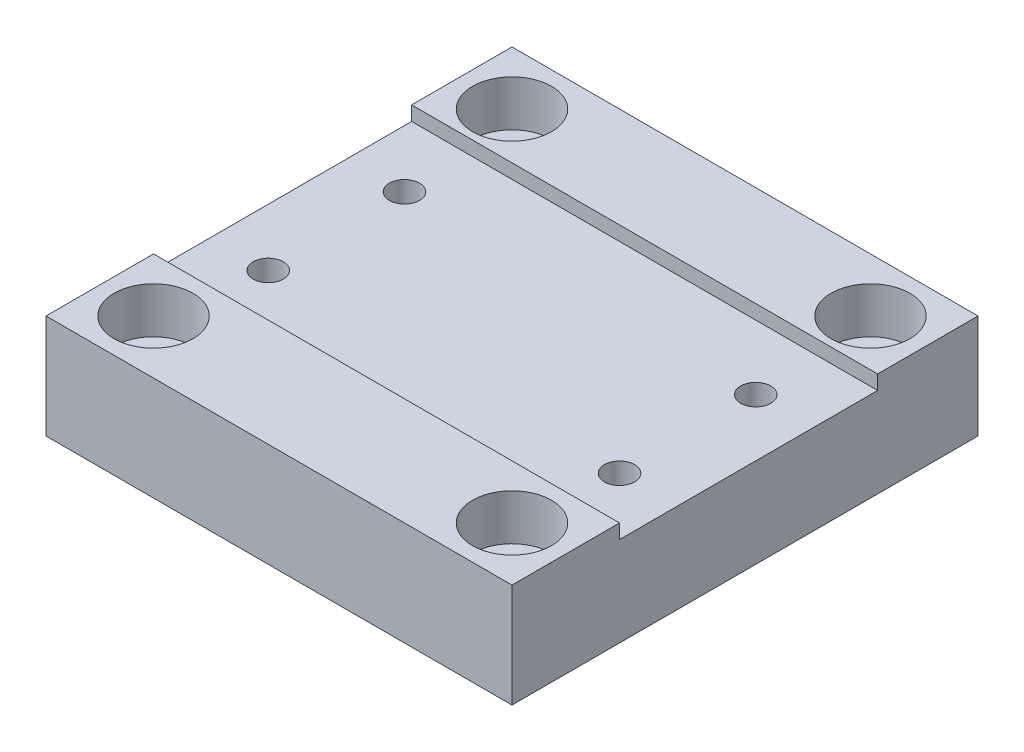
ISO-10303-21;
HEADER;
FILE_DESCRIPTION(('STEP AP214'),'2;1');
FILE_NAME('part.step','',(''),(''),'','','');
FILE_SCHEMA(('AUTOMOTIVE_DESIGN { 1 0 10303 214 1 1 1 1 }'));
ENDSEC;
DATA;
#1=APPLICATION_CONTEXT('core data for automotive mechanical design processes');
#2=APPLICATION_PROTOCOL_DEFINITION('international standard','automotive_design',2000,#1);
#3=PRODUCT_CONTEXT('',#1,'mechanical');
#4=PRODUCT('Part','Part','',(#3));
#5=PRODUCT_RELATED_PRODUCT_CATEGORY('part','',(#4));
#6=PRODUCT_DEFINITION_FORMATION('','',#4);
#7=PRODUCT_DEFINITION_CONTEXT('part definition',#1,'design');
#8=PRODUCT_DEFINITION('design','',#6,#7);
#9=PRODUCT_DEFINITION_SHAPE('','',#8);
#10=(LENGTH_UNIT() NAMED_UNIT(*) SI_UNIT(.MILLI.,.METRE.));
#11=(NAMED_UNIT(*) PLANE_ANGLE_UNIT() SI_UNIT($,.RADIAN.));
#12=(NAMED_UNIT(*) SI_UNIT($,.STERADIAN.) SOLID_ANGLE_UNIT());
#13=UNCERTAINTY_MEASURE_WITH_UNIT(LENGTH_MEASURE(1.E-05),#10,'distance_accuracy_value','');
#14=(GEOMETRIC_REPRESENTATION_CONTEXT(3) GLOBAL_UNCERTAINTY_ASSIGNED_CONTEXT((#13)) GLOBAL_UNIT_ASSIGNED_CONTEXT((#10,
#11,#12)) REPRESENTATION_CONTEXT('',''));
#15=CARTESIAN_POINT('',(0.,0.,0.));
#16=DIRECTION('',(0.,0.,1.));
#17=DIRECTION('',(1.,0.,0.));
#18=AXIS2_PLACEMENT_3D('',#15,#16,#17);
#19=CARTESIAN_POINT('',(0.,14.5,0.));
#20=DIRECTION('',(0.,1.,0.));
#21=DIRECTION('',(0.,0.,1.));
#22=AXIS2_PLACEMENT_3D('',#19,#20,#21);
#23=PLANE('',#22);
#24=DIRECTION('',(-1.,0.,0.));
#25=VECTOR('',#24,1.);
#26=CARTESIAN_POINT('',(-32.5,14.5,-18.5));
#27=LINE('',#26,#25);
#28=CARTESIAN_POINT('',(32.5,14.5,-18.5));
#29=VERTEX_POINT('',#28);
#30=CARTESIAN_POINT('',(-32.5,14.5,-18.5));
#31=VERTEX_POINT('',#30);
#32=EDGE_CURVE('E122',#29,#31,#27,.T.);
#33=ORIENTED_EDGE('',*,*,#32,.F.);
#34=DIRECTION('',(0.,0.,-1.));
#35=VECTOR('',#34,1.);
#36=CARTESIAN_POINT('',(32.5,14.5,-32.5));
#37=LINE('',#36,#35);
#38=CARTESIAN_POINT('',(32.5,14.5,-32.5));
#39=VERTEX_POINT('',#38);
#40=EDGE_CURVE('E185',#29,#39,#37,.T.);
#41=ORIENTED_EDGE('',*,*,#40,.T.);
#42=DIRECTION('',(-1.,0.,0.));
#43=VECTOR('',#42,1.);
#44=CARTESIAN_POINT('',(-32.5,14.5,-32.5));
#45=LINE('',#44,#43);
#46=CARTESIAN_POINT('',(-32.5,14.5,-32.5));
#47=VERTEX_POINT('',#46);
#48=EDGE_CURVE('E56',#39,#47,#45,.T.);
#49=ORIENTED_EDGE('',*,*,#48,.T.);
#50=DIRECTION('',(0.,0.,1.));
#51=VECTOR('',#50,1.);
#52=CARTESIAN_POINT('',(-32.5,14.5,-32.5));
#53=LINE('',#52,#51);
#54=EDGE_CURVE('E181',#47,#31,#53,.T.);
#55=ORIENTED_EDGE('',*,*,#54,.T.);
#56=EDGE_LOOP('',(#33,#41,#49,#55));
#57=FACE_BOUND('',#56,.T.);
#58=CARTESIAN_POINT('',(25.,14.5,-25.));
#59=DIRECTION('',(0.,1.,0.));
#60=DIRECTION('',(0.,0.,1.));
#61=AXIS2_PLACEMENT_3D('',#58,#59,#60);
#62=CIRCLE('',#61,5.5);
#63=CARTESIAN_POINT('',(25.,14.5,-19.5));
#64=VERTEX_POINT('',#63);
#65=EDGE_CURVE('E156',#64,#64,#62,.T.);
#66=ORIENTED_EDGE('',*,*,#65,.F.);
#67=EDGE_LOOP('',(#66));
#68=FACE_BOUND('',#67,.T.);
#69=CARTESIAN_POINT('',(-25.,14.5,-25.));
#70=DIRECTION('',(0.,1.,0.));
#71=DIRECTION('',(0.,0.,1.));
#72=AXIS2_PLACEMENT_3D('',#69,#70,#71);
#73=CIRCLE('',#72,5.5);
#74=CARTESIAN_POINT('',(-25.,14.5,-19.5));
#75=VERTEX_POINT('',#74);
#76=EDGE_CURVE('E144',#75,#75,#73,.T.);
#77=ORIENTED_EDGE('',*,*,#76,.F.);
#78=EDGE_LOOP('',(#77));
#79=FACE_BOUND('',#78,.T.);
#80=ADVANCED_FACE('F32',(#57,#68,#79),#23,.T.);
#81=CARTESIAN_POINT('',(-32.5,14.5,-32.5));
#82=DIRECTION('',(1.,0.,0.));
#83=DIRECTION('',(0.,0.,-1.));
#84=AXIS2_PLACEMENT_3D('',#81,#82,#83);
#85=PLANE('',#84);
#86=DIRECTION('',(0.,0.,1.));
#87=VECTOR('',#86,1.);
#88=CARTESIAN_POINT('',(-32.5,12.5,17.5));
#89=LINE('',#88,#87);
#90=CARTESIAN_POINT('',(-32.5,12.5,-18.5));
#91=VERTEX_POINT('',#90);
#92=CARTESIAN_POINT('',(-32.5,12.5,17.5));
#93=VERTEX_POINT('',#92);
#94=EDGE_CURVE('E113',#91,#93,#89,.T.);
#95=ORIENTED_EDGE('',*,*,#94,.F.);
#96=DIRECTION('',(0.,1.,0.));
#97=VECTOR('',#96,1.);
#98=CARTESIAN_POINT('',(-32.5,12.5,-18.5));
#99=LINE('',#98,#97);
#100=EDGE_CURVE('E135',#91,#31,#99,.T.);
#101=ORIENTED_EDGE('',*,*,#100,.T.);
#102=ORIENTED_EDGE('',*,*,#54,.F.);
#103=DIRECTION('',(0.,-1.,0.));
#104=VECTOR('',#103,1.);
#105=CARTESIAN_POINT('',(-32.5,14.5,-32.5));
#106=LINE('',#105,#104);
#107=CARTESIAN_POINT('',(-32.5,0.,-32.5));
#108=VERTEX_POINT('',#107);
#109=EDGE_CURVE('E190',#47,#108,#106,.T.);
#110=ORIENTED_EDGE('',*,*,#109,.T.);
#111=DIRECTION('',(0.,0.,1.));
#112=VECTOR('',#111,1.);
#113=CARTESIAN_POINT('',(-32.5,0.,-32.5));
#114=LINE('',#113,#112);
#115=CARTESIAN_POINT('',(-32.5,0.,32.5));
#116=VERTEX_POINT('',#115);
#117=EDGE_CURVE('E180',#108,#116,#114,.T.);
#118=ORIENTED_EDGE('',*,*,#117,.T.);
#119=DIRECTION('',(0.,-1.,0.));
#120=VECTOR('',#119,1.);
#121=CARTESIAN_POINT('',(-32.5,14.5,32.5));
#122=LINE('',#121,#120);
#123=CARTESIAN_POINT('',(-32.5,14.5,32.5));
#124=VERTEX_POINT('',#123);
#125=EDGE_CURVE('E11',#124,#116,#122,.T.);
#126=ORIENTED_EDGE('',*,*,#125,.F.);
#127=CARTESIAN_POINT('',(-32.5,14.5,17.5));
#128=VERTEX_POINT('',#127);
#129=EDGE_CURVE('E84',#128,#124,#53,.T.);
#130=ORIENTED_EDGE('',*,*,#129,.F.);
#131=DIRECTION('',(0.,1.,0.));
#132=VECTOR('',#131,1.);
#133=CARTESIAN_POINT('',(-32.5,12.5,17.5));
#134=LINE('',#133,#132);
#135=EDGE_CURVE('E47',#93,#128,#134,.T.);
#136=ORIENTED_EDGE('',*,*,#135,.F.);
#137=EDGE_LOOP('',(#95,#101,#102,#110,#118,#126,#130,#136));
#138=FACE_BOUND('',#137,.T.);
#139=ADVANCED_FACE('F34',(#138),#85,.F.);
#140=CARTESIAN_POINT('',(-32.5,14.5,32.5));
#141=DIRECTION('',(0.,0.,-1.));
#142=DIRECTION('',(-1.,0.,0.));
#143=AXIS2_PLACEMENT_3D('',#140,#141,#142);
#144=PLANE('',#143);
#145=DIRECTION('',(1.,0.,0.));
#146=VECTOR('',#145,1.);
#147=CARTESIAN_POINT('',(-32.5,0.,32.5));
#148=LINE('',#147,#146);
#149=CARTESIAN_POINT('',(32.5,0.,32.5));
#150=VERTEX_POINT('',#149);
#151=EDGE_CURVE('E193',#116,#150,#148,.T.);
#152=ORIENTED_EDGE('',*,*,#151,.T.);
#153=DIRECTION('',(0.,-1.,0.));
#154=VECTOR('',#153,1.);
#155=CARTESIAN_POINT('',(32.5,14.5,32.5));
#156=LINE('',#155,#154);
#157=CARTESIAN_POINT('',(32.5,14.5,32.5));
#158=VERTEX_POINT('',#157);
#159=EDGE_CURVE('E40',#158,#150,#156,.T.);
#160=ORIENTED_EDGE('',*,*,#159,.F.);
#161=DIRECTION('',(1.,0.,0.));
#162=VECTOR('',#161,1.);
#163=CARTESIAN_POINT('',(-32.5,14.5,32.5));
#164=LINE('',#163,#162);
#165=EDGE_CURVE('E183',#124,#158,#164,.T.);
#166=ORIENTED_EDGE('',*,*,#165,.F.);
#167=ORIENTED_EDGE('',*,*,#125,.T.);
#168=EDGE_LOOP('',(#152,#160,#166,#167));
#169=FACE_BOUND('',#168,.T.);
#170=ADVANCED_FACE('F242',(#169),#144,.F.);
#171=CARTESIAN_POINT('',(32.5,14.5,-32.5));
#172=DIRECTION('',(-1.,0.,0.));
#173=DIRECTION('',(0.,0.,1.));
#174=AXIS2_PLACEMENT_3D('',#171,#172,#173);
#175=PLANE('',#174);
#176=ORIENTED_EDGE('',*,*,#40,.F.);
#177=DIRECTION('',(0.,1.,0.));
#178=VECTOR('',#177,1.);
#179=CARTESIAN_POINT('',(32.5,12.5,-18.5));
#180=LINE('',#179,#178);
#181=CARTESIAN_POINT('',(32.5,12.5,-18.5));
#182=VERTEX_POINT('',#181);
#183=EDGE_CURVE('E126',#182,#29,#180,.T.);
#184=ORIENTED_EDGE('',*,*,#183,.F.);
#185=DIRECTION('',(0.,0.,-1.));
#186=VECTOR('',#185,1.);
#187=CARTESIAN_POINT('',(32.5,12.5,17.5));
#188=LINE('',#187,#186);
#189=CARTESIAN_POINT('',(32.5,12.5,17.5));
#190=VERTEX_POINT('',#189);
#191=EDGE_CURVE('E112',#190,#182,#188,.T.);
#192=ORIENTED_EDGE('',*,*,#191,.F.);
#193=DIRECTION('',(0.,1.,0.));
#194=VECTOR('',#193,1.);
#195=CARTESIAN_POINT('',(32.5,12.5,17.5));
#196=LINE('',#195,#194);
#197=CARTESIAN_POINT('',(32.5,14.5,17.5));
#198=VERTEX_POINT('',#197);
#199=EDGE_CURVE('E109',#190,#198,#196,.T.);
#200=ORIENTED_EDGE('',*,*,#199,.T.);
#201=EDGE_CURVE('E186',#158,#198,#37,.T.);
#202=ORIENTED_EDGE('',*,*,#201,.F.);
#203=ORIENTED_EDGE('',*,*,#159,.T.);
#204=DIRECTION('',(0.,0.,-1.));
#205=VECTOR('',#204,1.);
#206=CARTESIAN_POINT('',(32.5,0.,-32.5));
#207=LINE('',#206,#205);
#208=CARTESIAN_POINT('',(32.5,0.,-32.5));
#209=VERTEX_POINT('',#208);
#210=EDGE_CURVE('E195',#150,#209,#207,.T.);
#211=ORIENTED_EDGE('',*,*,#210,.T.);
#212=DIRECTION('',(0.,-1.,0.));
#213=VECTOR('',#212,1.);
#214=CARTESIAN_POINT('',(32.5,14.5,-32.5));
#215=LINE('',#214,#213);
#216=EDGE_CURVE('E199',#39,#209,#215,.T.);
#217=ORIENTED_EDGE('',*,*,#216,.F.);
#218=EDGE_LOOP('',(#176,#184,#192,#200,#202,#203,#211,#217));
#219=FACE_BOUND('',#218,.T.);
#220=ADVANCED_FACE('F206',(#219),#175,.F.);
#221=CARTESIAN_POINT('',(-32.5,14.5,-32.5));
#222=DIRECTION('',(0.,0.,1.));
#223=DIRECTION('',(1.,0.,0.));
#224=AXIS2_PLACEMENT_3D('',#221,#222,#223);
#225=PLANE('',#224);
#226=DIRECTION('',(-1.,0.,0.));
#227=VECTOR('',#226,1.);
#228=CARTESIAN_POINT('',(-32.5,0.,-32.5));
#229=LINE('',#228,#227);
#230=EDGE_CURVE('E77',#209,#108,#229,.T.);
#231=ORIENTED_EDGE('',*,*,#230,.T.);
#232=ORIENTED_EDGE('',*,*,#109,.F.);
#233=ORIENTED_EDGE('',*,*,#48,.F.);
#234=ORIENTED_EDGE('',*,*,#216,.T.);
#235=EDGE_LOOP('',(#231,#232,#233,#234));
#236=FACE_BOUND('',#235,.T.);
#237=ADVANCED_FACE('F213',(#236),#225,.F.);
#238=DIRECTION('',(1.,0.,0.));
#239=VECTOR('',#238,1.);
#240=CARTESIAN_POINT('',(-32.5,14.5,17.5));
#241=LINE('',#240,#239);
#242=EDGE_CURVE('E218',#128,#198,#241,.T.);
#243=ORIENTED_EDGE('',*,*,#242,.F.);
#244=ORIENTED_EDGE('',*,*,#129,.T.);
#245=ORIENTED_EDGE('',*,*,#165,.T.);
#246=ORIENTED_EDGE('',*,*,#201,.T.);
#247=EDGE_LOOP('',(#243,#244,#245,#246));
#248=FACE_BOUND('',#247,.T.);
#249=CARTESIAN_POINT('',(-25.,14.5,25.));
#250=DIRECTION('',(0.,1.,0.));
#251=DIRECTION('',(0.,0.,1.));
#252=AXIS2_PLACEMENT_3D('',#249,#250,#251);
#253=CIRCLE('',#252,5.5);
#254=CARTESIAN_POINT('',(-25.,14.5,30.5));
#255=VERTEX_POINT('',#254);
#256=EDGE_CURVE('E131',#255,#255,#253,.T.);
#257=ORIENTED_EDGE('',*,*,#256,.F.);
#258=EDGE_LOOP('',(#257));
#259=FACE_BOUND('',#258,.T.);
#260=CARTESIAN_POINT('',(25.,14.5,25.));
#261=DIRECTION('',(0.,1.,0.));
#262=DIRECTION('',(0.,0.,1.));
#263=AXIS2_PLACEMENT_3D('',#260,#261,#262);
#264=CIRCLE('',#263,5.5);
#265=CARTESIAN_POINT('',(25.,14.5,30.5));
#266=VERTEX_POINT('',#265);
#267=EDGE_CURVE('E168',#266,#266,#264,.T.);
#268=ORIENTED_EDGE('',*,*,#267,.F.);
#269=EDGE_LOOP('',(#268));
#270=FACE_BOUND('',#269,.T.);
#271=ADVANCED_FACE('F238',(#248,#259,#270),#23,.T.);
#272=CARTESIAN_POINT('',(0.,0.,0.));
#273=DIRECTION('',(0.,1.,0.));
#274=DIRECTION('',(0.,0.,1.));
#275=AXIS2_PLACEMENT_3D('',#272,#273,#274);
#276=PLANE('',#275);
#277=CARTESIAN_POINT('',(24.5,0.,9.49999999999997));
#278=DIRECTION('',(0.,1.,0.));
#279=DIRECTION('',(0.,0.,1.));
#280=AXIS2_PLACEMENT_3D('',#277,#278,#279);
#281=CIRCLE('',#280,2.1);
#282=CARTESIAN_POINT('',(24.5,0.,11.6));
#283=VERTEX_POINT('',#282);
#284=EDGE_CURVE('E468',#283,#283,#281,.T.);
#285=ORIENTED_EDGE('',*,*,#284,.T.);
#286=EDGE_LOOP('',(#285));
#287=FACE_BOUND('',#286,.T.);
#288=CARTESIAN_POINT('',(24.5,0.,-9.50000000000002));
#289=DIRECTION('',(0.,1.,0.));
#290=DIRECTION('',(0.,0.,1.));
#291=AXIS2_PLACEMENT_3D('',#288,#289,#290);
#292=CIRCLE('',#291,2.1);
#293=CARTESIAN_POINT('',(24.5,0.,-7.40000000000002));
#294=VERTEX_POINT('',#293);
#295=EDGE_CURVE('E478',#294,#294,#292,.T.);
#296=ORIENTED_EDGE('',*,*,#295,.T.);
#297=EDGE_LOOP('',(#296));
#298=FACE_BOUND('',#297,.T.);
#299=CARTESIAN_POINT('',(-24.5,0.,-9.50000000000002));
#300=DIRECTION('',(0.,1.,0.));
#301=DIRECTION('',(0.,0.,1.));
#302=AXIS2_PLACEMENT_3D('',#299,#300,#301);
#303=CIRCLE('',#302,2.1);
#304=CARTESIAN_POINT('',(-24.5,0.,-7.40000000000002));
#305=VERTEX_POINT('',#304);
#306=EDGE_CURVE('E484',#305,#305,#303,.T.);
#307=ORIENTED_EDGE('',*,*,#306,.T.);
#308=EDGE_LOOP('',(#307));
#309=FACE_BOUND('',#308,.T.);
#310=CARTESIAN_POINT('',(-24.5,0.,9.49999999999997));
#311=DIRECTION('',(0.,1.,0.));
#312=DIRECTION('',(0.,0.,1.));
#313=AXIS2_PLACEMENT_3D('',#310,#311,#312);
#314=CIRCLE('',#313,2.1);
#315=CARTESIAN_POINT('',(-24.5,0.,11.6));
#316=VERTEX_POINT('',#315);
#317=EDGE_CURVE('E220',#316,#316,#314,.T.);
#318=ORIENTED_EDGE('',*,*,#317,.T.);
#319=EDGE_LOOP('',(#318));
#320=FACE_BOUND('',#319,.T.);
#321=CARTESIAN_POINT('',(-25.,0.,25.));
#322=DIRECTION('',(0.,1.,0.));
#323=DIRECTION('',(0.,0.,1.));
#324=AXIS2_PLACEMENT_3D('',#321,#322,#323);
#325=CIRCLE('',#324,3.3);
#326=CARTESIAN_POINT('',(-25.,0.,28.3));
#327=VERTEX_POINT('',#326);
#328=EDGE_CURVE('E141',#327,#327,#325,.T.);
#329=ORIENTED_EDGE('',*,*,#328,.T.);
#330=EDGE_LOOP('',(#329));
#331=FACE_BOUND('',#330,.T.);
#332=CARTESIAN_POINT('',(-25.,0.,-25.));
#333=DIRECTION('',(0.,1.,0.));
#334=DIRECTION('',(0.,0.,1.));
#335=AXIS2_PLACEMENT_3D('',#332,#333,#334);
#336=CIRCLE('',#335,3.3);
#337=CARTESIAN_POINT('',(-25.,0.,-21.7));
#338=VERTEX_POINT('',#337);
#339=EDGE_CURVE('E153',#338,#338,#336,.T.);
#340=ORIENTED_EDGE('',*,*,#339,.T.);
#341=EDGE_LOOP('',(#340));
#342=FACE_BOUND('',#341,.T.);
#343=CARTESIAN_POINT('',(25.,0.,-25.));
#344=DIRECTION('',(0.,1.,0.));
#345=DIRECTION('',(0.,0.,1.));
#346=AXIS2_PLACEMENT_3D('',#343,#344,#345);
#347=CIRCLE('',#346,3.3);
#348=CARTESIAN_POINT('',(25.,0.,-21.7));
#349=VERTEX_POINT('',#348);
#350=EDGE_CURVE('E165',#349,#349,#347,.T.);
#351=ORIENTED_EDGE('',*,*,#350,.T.);
#352=EDGE_LOOP('',(#351));
#353=FACE_BOUND('',#352,.T.);
#354=CARTESIAN_POINT('',(25.,0.,25.));
#355=DIRECTION('',(0.,1.,0.));
#356=DIRECTION('',(0.,0.,1.));
#357=AXIS2_PLACEMENT_3D('',#354,#355,#356);
#358=CIRCLE('',#357,3.3);
#359=CARTESIAN_POINT('',(25.,0.,28.3));
#360=VERTEX_POINT('',#359);
#361=EDGE_CURVE('E177',#360,#360,#358,.T.);
#362=ORIENTED_EDGE('',*,*,#361,.T.);
#363=EDGE_LOOP('',(#362));
#364=FACE_BOUND('',#363,.T.);
#365=ORIENTED_EDGE('',*,*,#117,.F.);
#366=ORIENTED_EDGE('',*,*,#230,.F.);
#367=ORIENTED_EDGE('',*,*,#210,.F.);
#368=ORIENTED_EDGE('',*,*,#151,.F.);
#369=EDGE_LOOP('',(#365,#366,#367,#368));
#370=FACE_BOUND('',#369,.T.);
#371=ADVANCED_FACE('F211',(#287,#298,#309,#320,#331,#342,#353,#364,#370),#276,.F.);
#372=CARTESIAN_POINT('',(25.,14.5,25.));
#373=DIRECTION('',(0.,1.,0.));
#374=DIRECTION('',(0.,0.,1.));
#375=AXIS2_PLACEMENT_3D('',#372,#373,#374);
#376=CYLINDRICAL_SURFACE('',#375,3.3);
#377=ORIENTED_EDGE('',*,*,#361,.F.);
#378=EDGE_LOOP('',(#377));
#379=FACE_BOUND('',#378,.T.);
#380=CARTESIAN_POINT('',(25.,8.1,25.));
#381=DIRECTION('',(0.,1.,0.));
#382=DIRECTION('',(0.,0.,1.));
#383=AXIS2_PLACEMENT_3D('',#380,#381,#382);
#384=CIRCLE('',#383,3.3);
#385=CARTESIAN_POINT('',(25.,8.1,28.3));
#386=VERTEX_POINT('',#385);
#387=EDGE_CURVE('E174',#386,#386,#384,.T.);
#388=ORIENTED_EDGE('',*,*,#387,.T.);
#389=EDGE_LOOP('',(#388));
#390=FACE_BOUND('',#389,.T.);
#391=ADVANCED_FACE('F250',(#379,#390),#376,.F.);
#392=CARTESIAN_POINT('',(28.3,8.1,25.));
#393=DIRECTION('',(0.,-1.,0.));
#394=DIRECTION('',(0.,0.,-1.));
#395=AXIS2_PLACEMENT_3D('',#392,#393,#394);
#396=PLANE('',#395);
#397=ORIENTED_EDGE('',*,*,#387,.F.);
#398=EDGE_LOOP('',(#397));
#399=FACE_BOUND('',#398,.T.);
#400=CARTESIAN_POINT('',(25.,8.1,25.));
#401=DIRECTION('',(0.,1.,0.));
#402=DIRECTION('',(0.,0.,1.));
#403=AXIS2_PLACEMENT_3D('',#400,#401,#402);
#404=CIRCLE('',#403,5.5);
#405=CARTESIAN_POINT('',(25.,8.1,30.5));
#406=VERTEX_POINT('',#405);
#407=EDGE_CURVE('E171',#406,#406,#404,.T.);
#408=ORIENTED_EDGE('',*,*,#407,.T.);
#409=EDGE_LOOP('',(#408));
#410=FACE_BOUND('',#409,.T.);
#411=ADVANCED_FACE('F261',(#399,#410),#396,.F.);
#412=CARTESIAN_POINT('',(25.,14.5,25.));
#413=DIRECTION('',(0.,1.,0.));
#414=DIRECTION('',(0.,0.,1.));
#415=AXIS2_PLACEMENT_3D('',#412,#413,#414);
#416=CYLINDRICAL_SURFACE('',#415,5.5);
#417=ORIENTED_EDGE('',*,*,#407,.F.);
#418=EDGE_LOOP('',(#417));
#419=FACE_BOUND('',#418,.T.);
#420=ORIENTED_EDGE('',*,*,#267,.T.);
#421=EDGE_LOOP('',(#420));
#422=FACE_BOUND('',#421,.T.);
#423=ADVANCED_FACE('F258',(#419,#422),#416,.F.);
#424=CARTESIAN_POINT('',(25.,14.5,-25.));
#425=DIRECTION('',(0.,1.,0.));
#426=DIRECTION('',(0.,0.,1.));
#427=AXIS2_PLACEMENT_3D('',#424,#425,#426);
#428=CYLINDRICAL_SURFACE('',#427,3.3);
#429=ORIENTED_EDGE('',*,*,#350,.F.);
#430=EDGE_LOOP('',(#429));
#431=FACE_BOUND('',#430,.T.);
#432=CARTESIAN_POINT('',(25.,8.1,-25.));
#433=DIRECTION('',(0.,1.,0.));
#434=DIRECTION('',(0.,0.,1.));
#435=AXIS2_PLACEMENT_3D('',#432,#433,#434);
#436=CIRCLE('',#435,3.3);
#437=CARTESIAN_POINT('',(25.,8.1,-21.7));
#438=VERTEX_POINT('',#437);
#439=EDGE_CURVE('E162',#438,#438,#436,.T.);
#440=ORIENTED_EDGE('',*,*,#439,.T.);
#441=EDGE_LOOP('',(#440));
#442=FACE_BOUND('',#441,.T.);
#443=ADVANCED_FACE('F260',(#431,#442),#428,.F.);
#444=CARTESIAN_POINT('',(28.3,8.1,-25.));
#445=DIRECTION('',(0.,-1.,0.));
#446=DIRECTION('',(0.,0.,-1.));
#447=AXIS2_PLACEMENT_3D('',#444,#445,#446);
#448=PLANE('',#447);
#449=ORIENTED_EDGE('',*,*,#439,.F.);
#450=EDGE_LOOP('',(#449));
#451=FACE_BOUND('',#450,.T.);
#452=CARTESIAN_POINT('',(25.,8.1,-25.));
#453=DIRECTION('',(0.,1.,0.));
#454=DIRECTION('',(0.,0.,1.));
#455=AXIS2_PLACEMENT_3D('',#452,#453,#454);
#456=CIRCLE('',#455,5.5);
#457=CARTESIAN_POINT('',(25.,8.1,-19.5));
#458=VERTEX_POINT('',#457);
#459=EDGE_CURVE('E159',#458,#458,#456,.T.);
#460=ORIENTED_EDGE('',*,*,#459,.T.);
#461=EDGE_LOOP('',(#460));
#462=FACE_BOUND('',#461,.T.);
#463=ADVANCED_FACE('F268',(#451,#462),#448,.F.);
#464=CARTESIAN_POINT('',(25.,14.5,-25.));
#465=DIRECTION('',(0.,1.,0.));
#466=DIRECTION('',(0.,0.,1.));
#467=AXIS2_PLACEMENT_3D('',#464,#465,#466);
#468=CYLINDRICAL_SURFACE('',#467,5.5);
#469=ORIENTED_EDGE('',*,*,#459,.F.);
#470=EDGE_LOOP('',(#469));
#471=FACE_BOUND('',#470,.T.);
#472=ORIENTED_EDGE('',*,*,#65,.T.);
#473=EDGE_LOOP('',(#472));
#474=FACE_BOUND('',#473,.T.);
#475=ADVANCED_FACE('F310',(#471,#474),#468,.F.);
#476=CARTESIAN_POINT('',(-25.,14.5,-25.));
#477=DIRECTION('',(0.,1.,0.));
#478=DIRECTION('',(0.,0.,1.));
#479=AXIS2_PLACEMENT_3D('',#476,#477,#478);
#480=CYLINDRICAL_SURFACE('',#479,3.3);
#481=ORIENTED_EDGE('',*,*,#339,.F.);
#482=EDGE_LOOP('',(#481));
#483=FACE_BOUND('',#482,.T.);
#484=CARTESIAN_POINT('',(-25.,8.1,-25.));
#485=DIRECTION('',(0.,1.,0.));
#486=DIRECTION('',(0.,0.,1.));
#487=AXIS2_PLACEMENT_3D('',#484,#485,#486);
#488=CIRCLE('',#487,3.3);
#489=CARTESIAN_POINT('',(-25.,8.1,-21.7));
#490=VERTEX_POINT('',#489);
#491=EDGE_CURVE('E150',#490,#490,#488,.T.);
#492=ORIENTED_EDGE('',*,*,#491,.T.);
#493=EDGE_LOOP('',(#492));
#494=FACE_BOUND('',#493,.T.);
#495=ADVANCED_FACE('F319',(#483,#494),#480,.F.);
#496=CARTESIAN_POINT('',(-21.7,8.1,-25.));
#497=DIRECTION('',(0.,-1.,0.));
#498=DIRECTION('',(0.,0.,-1.));
#499=AXIS2_PLACEMENT_3D('',#496,#497,#498);
#500=PLANE('',#499);
#501=ORIENTED_EDGE('',*,*,#491,.F.);
#502=EDGE_LOOP('',(#501));
#503=FACE_BOUND('',#502,.T.);
#504=CARTESIAN_POINT('',(-25.,8.1,-25.));
#505=DIRECTION('',(0.,1.,0.));
#506=DIRECTION('',(0.,0.,1.));
#507=AXIS2_PLACEMENT_3D('',#504,#505,#506);
#508=CIRCLE('',#507,5.5);
#509=CARTESIAN_POINT('',(-25.,8.1,-19.5));
#510=VERTEX_POINT('',#509);
#511=EDGE_CURVE('E147',#510,#510,#508,.T.);
#512=ORIENTED_EDGE('',*,*,#511,.T.);
#513=EDGE_LOOP('',(#512));
#514=FACE_BOUND('',#513,.T.);
#515=ADVANCED_FACE('F329',(#503,#514),#500,.F.);
#516=CARTESIAN_POINT('',(-25.,14.5,-25.));
#517=DIRECTION('',(0.,1.,0.));
#518=DIRECTION('',(0.,0.,1.));
#519=AXIS2_PLACEMENT_3D('',#516,#517,#518);
#520=CYLINDRICAL_SURFACE('',#519,5.5);
#521=ORIENTED_EDGE('',*,*,#511,.F.);
#522=EDGE_LOOP('',(#521));
#523=FACE_BOUND('',#522,.T.);
#524=ORIENTED_EDGE('',*,*,#76,.T.);
#525=EDGE_LOOP('',(#524));
#526=FACE_BOUND('',#525,.T.);
#527=ADVANCED_FACE('F339',(#523,#526),#520,.F.);
#528=CARTESIAN_POINT('',(-25.,14.5,25.));
#529=DIRECTION('',(0.,1.,0.));
#530=DIRECTION('',(0.,0.,1.));
#531=AXIS2_PLACEMENT_3D('',#528,#529,#530);
#532=CYLINDRICAL_SURFACE('',#531,3.3);
#533=ORIENTED_EDGE('',*,*,#328,.F.);
#534=EDGE_LOOP('',(#533));
#535=FACE_BOUND('',#534,.T.);
#536=CARTESIAN_POINT('',(-25.,8.1,25.));
#537=DIRECTION('',(0.,1.,0.));
#538=DIRECTION('',(0.,0.,1.));
#539=AXIS2_PLACEMENT_3D('',#536,#537,#538);
#540=CIRCLE('',#539,3.3);
#541=CARTESIAN_POINT('',(-25.,8.1,28.3));
#542=VERTEX_POINT('',#541);
#543=EDGE_CURVE('E138',#542,#542,#540,.T.);
#544=ORIENTED_EDGE('',*,*,#543,.T.);
#545=EDGE_LOOP('',(#544));
#546=FACE_BOUND('',#545,.T.);
#547=ADVANCED_FACE('F349',(#535,#546),#532,.F.);
#548=CARTESIAN_POINT('',(-21.7,8.1,25.));
#549=DIRECTION('',(0.,-1.,0.));
#550=DIRECTION('',(0.,0.,-1.));
#551=AXIS2_PLACEMENT_3D('',#548,#549,#550);
#552=PLANE('',#551);
#553=ORIENTED_EDGE('',*,*,#543,.F.);
#554=EDGE_LOOP('',(#553));
#555=FACE_BOUND('',#554,.T.);
#556=CARTESIAN_POINT('',(-25.,8.1,25.));
#557=DIRECTION('',(0.,1.,0.));
#558=DIRECTION('',(0.,0.,1.));
#559=AXIS2_PLACEMENT_3D('',#556,#557,#558);
#560=CIRCLE('',#559,5.5);
#561=CARTESIAN_POINT('',(-25.,8.1,30.5));
#562=VERTEX_POINT('',#561);
#563=EDGE_CURVE('E134',#562,#562,#560,.T.);
#564=ORIENTED_EDGE('',*,*,#563,.T.);
#565=EDGE_LOOP('',(#564));
#566=FACE_BOUND('',#565,.T.);
#567=ADVANCED_FACE('F232',(#555,#566),#552,.F.);
#568=CARTESIAN_POINT('',(-25.,14.5,25.));
#569=DIRECTION('',(0.,1.,0.));
#570=DIRECTION('',(0.,0.,1.));
#571=AXIS2_PLACEMENT_3D('',#568,#569,#570);
#572=CYLINDRICAL_SURFACE('',#571,5.5);
#573=ORIENTED_EDGE('',*,*,#563,.F.);
#574=EDGE_LOOP('',(#573));
#575=FACE_BOUND('',#574,.T.);
#576=ORIENTED_EDGE('',*,*,#256,.T.);
#577=EDGE_LOOP('',(#576));
#578=FACE_BOUND('',#577,.T.);
#579=ADVANCED_FACE('F225',(#575,#578),#572,.F.);
#580=CARTESIAN_POINT('',(-32.5,12.5,-18.5));
#581=DIRECTION('',(0.,0.,-1.));
#582=DIRECTION('',(-1.,0.,0.));
#583=AXIS2_PLACEMENT_3D('',#580,#581,#582);
#584=PLANE('',#583);
#585=ORIENTED_EDGE('',*,*,#32,.T.);
#586=ORIENTED_EDGE('',*,*,#100,.F.);
#587=DIRECTION('',(-1.,0.,0.));
#588=VECTOR('',#587,1.);
#589=CARTESIAN_POINT('',(-32.5,12.5,-18.5));
#590=LINE('',#589,#588);
#591=EDGE_CURVE('E119',#182,#91,#590,.T.);
#592=ORIENTED_EDGE('',*,*,#591,.F.);
#593=ORIENTED_EDGE('',*,*,#183,.T.);
#594=EDGE_LOOP('',(#585,#586,#592,#593));
#595=FACE_BOUND('',#594,.T.);
#596=ADVANCED_FACE('F223',(#595),#584,.F.);
#597=CARTESIAN_POINT('',(-32.5,12.5,17.5));
#598=DIRECTION('',(0.,0.,1.));
#599=DIRECTION('',(1.,0.,0.));
#600=AXIS2_PLACEMENT_3D('',#597,#598,#599);
#601=PLANE('',#600);
#602=ORIENTED_EDGE('',*,*,#242,.T.);
#603=ORIENTED_EDGE('',*,*,#199,.F.);
#604=DIRECTION('',(1.,0.,0.));
#605=VECTOR('',#604,1.);
#606=CARTESIAN_POINT('',(-32.5,12.5,17.5));
#607=LINE('',#606,#605);
#608=EDGE_CURVE('E105',#93,#190,#607,.T.);
#609=ORIENTED_EDGE('',*,*,#608,.F.);
#610=ORIENTED_EDGE('',*,*,#135,.T.);
#611=EDGE_LOOP('',(#602,#603,#609,#610));
#612=FACE_BOUND('',#611,.T.);
#613=ADVANCED_FACE('F107',(#612),#601,.F.);
#614=CARTESIAN_POINT('',(0.,12.5,0.));
#615=DIRECTION('',(0.,-1.,0.));
#616=DIRECTION('',(0.,0.,-1.));
#617=AXIS2_PLACEMENT_3D('',#614,#615,#616);
#618=PLANE('',#617);
#619=CARTESIAN_POINT('',(24.5,12.5,9.49999999999997));
#620=DIRECTION('',(0.,1.,0.));
#621=DIRECTION('',(0.,0.,1.));
#622=AXIS2_PLACEMENT_3D('',#619,#620,#621);
#623=CIRCLE('',#622,2.1);
#624=CARTESIAN_POINT('',(24.5,12.5,11.6));
#625=VERTEX_POINT('',#624);
#626=EDGE_CURVE('E471',#625,#625,#623,.T.);
#627=ORIENTED_EDGE('',*,*,#626,.F.);
#628=EDGE_LOOP('',(#627));
#629=FACE_BOUND('',#628,.T.);
#630=CARTESIAN_POINT('',(24.5,12.5,-9.50000000000002));
#631=DIRECTION('',(0.,1.,0.));
#632=DIRECTION('',(0.,0.,1.));
#633=AXIS2_PLACEMENT_3D('',#630,#631,#632);
#634=CIRCLE('',#633,2.1);
#635=CARTESIAN_POINT('',(24.5,12.5,-7.40000000000002));
#636=VERTEX_POINT('',#635);
#637=EDGE_CURVE('E473',#636,#636,#634,.T.);
#638=ORIENTED_EDGE('',*,*,#637,.F.);
#639=EDGE_LOOP('',(#638));
#640=FACE_BOUND('',#639,.T.);
#641=CARTESIAN_POINT('',(-24.5,12.5,-9.50000000000002));
#642=DIRECTION('',(0.,1.,0.));
#643=DIRECTION('',(0.,0.,1.));
#644=AXIS2_PLACEMENT_3D('',#641,#642,#643);
#645=CIRCLE('',#644,2.1);
#646=CARTESIAN_POINT('',(-24.5,12.5,-7.40000000000002));
#647=VERTEX_POINT('',#646);
#648=EDGE_CURVE('E481',#647,#647,#645,.T.);
#649=ORIENTED_EDGE('',*,*,#648,.F.);
#650=EDGE_LOOP('',(#649));
#651=FACE_BOUND('',#650,.T.);
#652=CARTESIAN_POINT('',(-24.5,12.5,9.49999999999997));
#653=DIRECTION('',(0.,1.,0.));
#654=DIRECTION('',(0.,0.,1.));
#655=AXIS2_PLACEMENT_3D('',#652,#653,#654);
#656=CIRCLE('',#655,2.1);
#657=CARTESIAN_POINT('',(-24.5,12.5,11.6));
#658=VERTEX_POINT('',#657);
#659=EDGE_CURVE('E487',#658,#658,#656,.T.);
#660=ORIENTED_EDGE('',*,*,#659,.F.);
#661=EDGE_LOOP('',(#660));
#662=FACE_BOUND('',#661,.T.);
#663=ORIENTED_EDGE('',*,*,#94,.T.);
#664=ORIENTED_EDGE('',*,*,#608,.T.);
#665=ORIENTED_EDGE('',*,*,#191,.T.);
#666=ORIENTED_EDGE('',*,*,#591,.T.);
#667=EDGE_LOOP('',(#663,#664,#665,#666));
#668=FACE_BOUND('',#667,.T.);
#669=ADVANCED_FACE('F117',(#629,#640,#651,#662,#668),#618,.F.);
#670=CARTESIAN_POINT('',(-24.5,12.5,9.49999999999997));
#671=DIRECTION('',(0.,1.,0.));
#672=DIRECTION('',(0.,0.,1.));
#673=AXIS2_PLACEMENT_3D('',#670,#671,#672);
#674=CYLINDRICAL_SURFACE('',#673,2.1);
#675=ORIENTED_EDGE('',*,*,#317,.F.);
#676=EDGE_LOOP('',(#675));
#677=FACE_BOUND('',#676,.T.);
#678=ORIENTED_EDGE('',*,*,#659,.T.);
#679=EDGE_LOOP('',(#678));
#680=FACE_BOUND('',#679,.T.);
#681=ADVANCED_FACE('F422',(#677,#680),#674,.F.);
#682=CARTESIAN_POINT('',(-24.5,12.5,-9.50000000000002));
#683=DIRECTION('',(0.,1.,0.));
#684=DIRECTION('',(0.,0.,1.));
#685=AXIS2_PLACEMENT_3D('',#682,#683,#684);
#686=CYLINDRICAL_SURFACE('',#685,2.1);
#687=ORIENTED_EDGE('',*,*,#306,.F.);
#688=EDGE_LOOP('',(#687));
#689=FACE_BOUND('',#688,.T.);
#690=ORIENTED_EDGE('',*,*,#648,.T.);
#691=EDGE_LOOP('',(#690));
#692=FACE_BOUND('',#691,.T.);
#693=ADVANCED_FACE('F431',(#689,#692),#686,.F.);
#694=CARTESIAN_POINT('',(24.5,12.5,-9.50000000000002));
#695=DIRECTION('',(0.,1.,0.));
#696=DIRECTION('',(0.,0.,1.));
#697=AXIS2_PLACEMENT_3D('',#694,#695,#696);
#698=CYLINDRICAL_SURFACE('',#697,2.1);
#699=ORIENTED_EDGE('',*,*,#295,.F.);
#700=EDGE_LOOP('',(#699));
#701=FACE_BOUND('',#700,.T.);
#702=ORIENTED_EDGE('',*,*,#637,.T.);
#703=EDGE_LOOP('',(#702));
#704=FACE_BOUND('',#703,.T.);
#705=ADVANCED_FACE('F441',(#701,#704),#698,.F.);
#706=CARTESIAN_POINT('',(24.5,12.5,9.49999999999997));
#707=DIRECTION('',(0.,1.,0.));
#708=DIRECTION('',(0.,0.,1.));
#709=AXIS2_PLACEMENT_3D('',#706,#707,#708);
#710=CYLINDRICAL_SURFACE('',#709,2.1);
#711=ORIENTED_EDGE('',*,*,#284,.F.);
#712=EDGE_LOOP('',(#711));
#713=FACE_BOUND('',#712,.T.);
#714=ORIENTED_EDGE('',*,*,#626,.T.);
#715=EDGE_LOOP('',(#714));
#716=FACE_BOUND('',#715,.T.);
#717=ADVANCED_FACE('F451',(#713,#716),#710,.F.);
#718=CLOSED_SHELL('',(#80,#139,#170,#220,#237,#271,#371,#391,#411,#423,#443,#463,#475,#495,#515,
#527,#547,#567,#579,#596,#613,#669,#681,#693,#705,#717));
#719=MANIFOLD_SOLID_BREP('B2',#718);
#720=ADVANCED_BREP_SHAPE_REPRESENTATION('',(#18,#719),#14);
#721=SHAPE_DEFINITION_REPRESENTATION(#9,#720);
ENDSEC;
END-ISO-10303-21;
